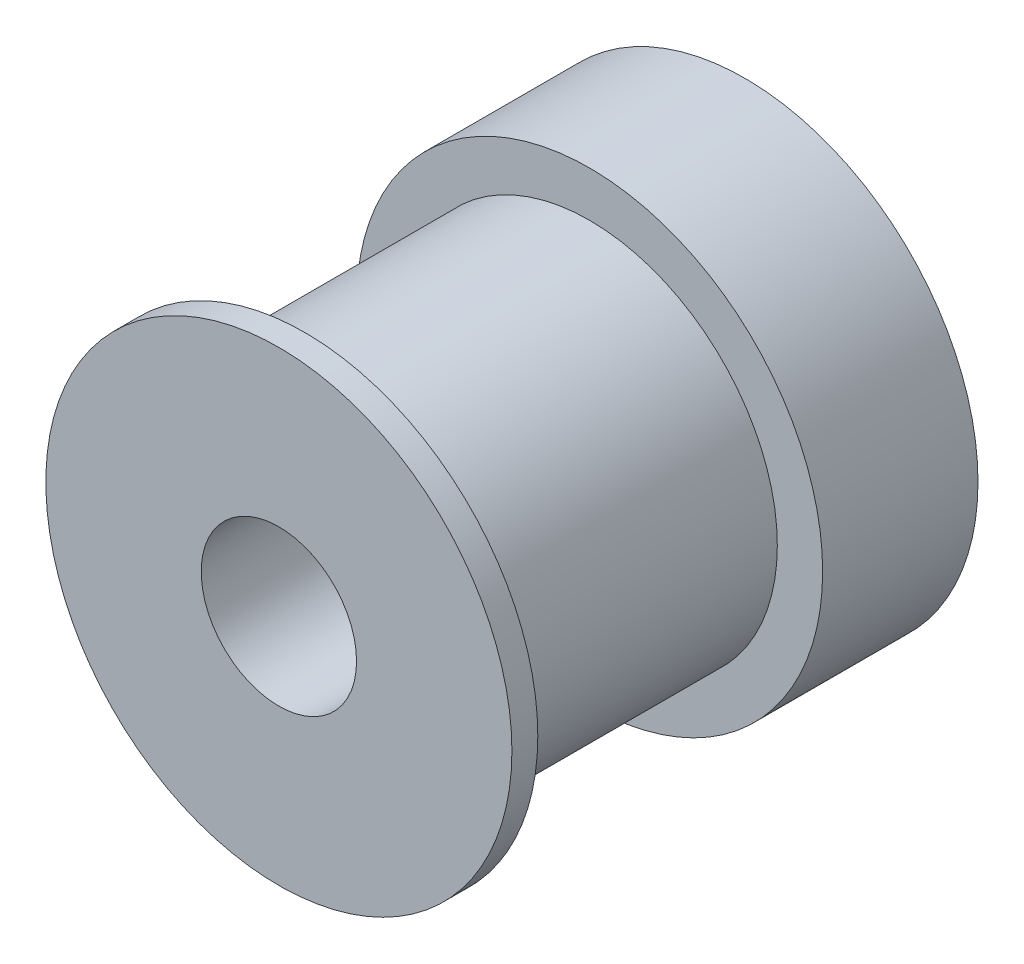
ISO-10303-21;
HEADER;
FILE_DESCRIPTION(('STEP AP214'),'2;1');
FILE_NAME('part.step','',(''),(''),'','','');
FILE_SCHEMA(('AUTOMOTIVE_DESIGN { 1 0 10303 214 1 1 1 1 }'));
ENDSEC;
DATA;
#1=APPLICATION_CONTEXT('core data for automotive mechanical design processes');
#2=APPLICATION_PROTOCOL_DEFINITION('international standard','automotive_design',2000,#1);
#3=PRODUCT_CONTEXT('',#1,'mechanical');
#4=PRODUCT('Part','Part','',(#3));
#5=PRODUCT_RELATED_PRODUCT_CATEGORY('part','',(#4));
#6=PRODUCT_DEFINITION_FORMATION('','',#4);
#7=PRODUCT_DEFINITION_CONTEXT('part definition',#1,'design');
#8=PRODUCT_DEFINITION('design','',#6,#7);
#9=PRODUCT_DEFINITION_SHAPE('','',#8);
#10=(LENGTH_UNIT() NAMED_UNIT(*) SI_UNIT(.MILLI.,.METRE.));
#11=(NAMED_UNIT(*) PLANE_ANGLE_UNIT() SI_UNIT($,.RADIAN.));
#12=(NAMED_UNIT(*) SI_UNIT($,.STERADIAN.) SOLID_ANGLE_UNIT());
#13=UNCERTAINTY_MEASURE_WITH_UNIT(LENGTH_MEASURE(1.E-05),#10,'distance_accuracy_value','');
#14=(GEOMETRIC_REPRESENTATION_CONTEXT(3) GLOBAL_UNCERTAINTY_ASSIGNED_CONTEXT((#13)) GLOBAL_UNIT_ASSIGNED_CONTEXT((#10,
#11,#12)) REPRESENTATION_CONTEXT('',''));
#15=CARTESIAN_POINT('',(0.,0.,0.));
#16=DIRECTION('',(0.,0.,1.));
#17=DIRECTION('',(1.,0.,0.));
#18=AXIS2_PLACEMENT_3D('',#15,#16,#17);
#19=CARTESIAN_POINT('',(0.,0.,6.));
#20=DIRECTION('',(0.,0.,1.));
#21=DIRECTION('',(1.,0.,0.));
#22=AXIS2_PLACEMENT_3D('',#19,#20,#21);
#23=PLANE('',#22);
#24=CARTESIAN_POINT('',(0.,0.,6.));
#25=DIRECTION('',(0.,0.,1.));
#26=DIRECTION('',(1.,0.,0.));
#27=AXIS2_PLACEMENT_3D('',#24,#25,#26);
#28=CIRCLE('',#27,7.25);
#29=CARTESIAN_POINT('',(7.25,0.,6.));
#30=VERTEX_POINT('',#29);
#31=EDGE_CURVE('E10',#30,#30,#28,.T.);
#32=ORIENTED_EDGE('',*,*,#31,.F.);
#33=EDGE_LOOP('',(#32));
#34=FACE_BOUND('',#33,.T.);
#35=CARTESIAN_POINT('',(0.,0.,6.));
#36=DIRECTION('',(0.,0.,1.));
#37=DIRECTION('',(1.,0.,0.));
#38=AXIS2_PLACEMENT_3D('',#35,#36,#37);
#39=CIRCLE('',#38,9.);
#40=CARTESIAN_POINT('',(9.,0.,6.));
#41=VERTEX_POINT('',#40);
#42=EDGE_CURVE('E46',#41,#41,#39,.T.);
#43=ORIENTED_EDGE('',*,*,#42,.T.);
#44=EDGE_LOOP('',(#43));
#45=FACE_BOUND('',#44,.T.);
#46=ADVANCED_FACE('F32',(#34,#45),#23,.T.);
#47=CARTESIAN_POINT('',(0.,0.,0.));
#48=DIRECTION('',(0.,0.,1.));
#49=DIRECTION('',(1.,0.,0.));
#50=AXIS2_PLACEMENT_3D('',#47,#48,#49);
#51=PLANE('',#50);
#52=CARTESIAN_POINT('',(0.,0.,0.));
#53=DIRECTION('',(0.,0.,1.));
#54=DIRECTION('',(1.,0.,0.));
#55=AXIS2_PLACEMENT_3D('',#52,#53,#54);
#56=CIRCLE('',#55,9.);
#57=CARTESIAN_POINT('',(9.,0.,0.));
#58=VERTEX_POINT('',#57);
#59=EDGE_CURVE('E51',#58,#58,#56,.T.);
#60=ORIENTED_EDGE('',*,*,#59,.F.);
#61=EDGE_LOOP('',(#60));
#62=FACE_BOUND('',#61,.T.);
#63=CARTESIAN_POINT('',(0.,0.,0.));
#64=DIRECTION('',(0.,0.,1.));
#65=DIRECTION('',(1.,0.,0.));
#66=AXIS2_PLACEMENT_3D('',#63,#64,#65);
#67=CIRCLE('',#66,3.);
#68=CARTESIAN_POINT('',(3.,0.,0.));
#69=VERTEX_POINT('',#68);
#70=EDGE_CURVE('E57',#69,#69,#67,.T.);
#71=ORIENTED_EDGE('',*,*,#70,.T.);
#72=EDGE_LOOP('',(#71));
#73=FACE_BOUND('',#72,.T.);
#74=ADVANCED_FACE('F63',(#62,#73),#51,.F.);
#75=CARTESIAN_POINT('',(0.,0.,6.));
#76=DIRECTION('',(0.,0.,-1.));
#77=DIRECTION('',(-1.,0.,0.));
#78=AXIS2_PLACEMENT_3D('',#75,#76,#77);
#79=CYLINDRICAL_SURFACE('',#78,9.);
#80=CARTESIAN_POINT('',(0.,-9.,5.5));
#81=CARTESIAN_POINT('',(0.0836345429749289,-8.99999856701294,5.49999664663131));
#82=CARTESIAN_POINT('',(0.167314729103293,-8.9988220674782,5.49298163501865));
#83=CARTESIAN_POINT('',(0.332328133003826,-8.99424206964832,5.46511860474081));
#84=CARTESIAN_POINT('',(0.413659120775548,-8.99083652354334,5.44425786585304));
#85=CARTESIAN_POINT('',(0.571562848327586,-8.9821804094187,5.38935073084435));
#86=CARTESIAN_POINT('',(0.64813942105914,-8.97693135095516,5.35531512061566));
#87=CARTESIAN_POINT('',(0.794485105186767,-8.96516536249242,5.27505262476856));
#88=CARTESIAN_POINT('',(0.864254993927155,-8.9586485775266,5.2288271335102));
#89=CARTESIAN_POINT('',(0.995683568575009,-8.94499990474988,5.12502694970772));
#90=CARTESIAN_POINT('',(1.05726774212098,-8.93786323088914,5.06735853121832));
#91=CARTESIAN_POINT('',(1.16993309919596,-8.92381576126039,4.94251121891631));
#92=CARTESIAN_POINT('',(1.22101361963458,-8.916904979776,4.87533172512603));
#93=CARTESIAN_POINT('',(1.31152027536308,-8.90404539455868,4.73285742028177));
#94=CARTESIAN_POINT('',(1.3508727317166,-8.89810277454982,4.65751519791714));
#95=CARTESIAN_POINT('',(1.41633501924673,-8.88791873876805,4.50117426141962));
#96=CARTESIAN_POINT('',(1.44244574493937,-8.88367720808584,4.42017592979342));
#97=CARTESIAN_POINT('',(1.48044862667088,-8.87742322105653,4.25561183508608));
#98=CARTESIAN_POINT('',(1.49246941748124,-8.8753906109142,4.17207655809916));
#99=CARTESIAN_POINT('',(1.50235003517393,-8.87372363361989,4.00415183386992));
#100=CARTESIAN_POINT('',(1.5002108642334,-8.87408909674328,3.91976244749962));
#101=CARTESIAN_POINT('',(1.48193705903769,-8.87715857318133,3.75344328323473));
#102=CARTESIAN_POINT('',(1.46594692913386,-8.8798384399135,3.67149711787286));
#103=CARTESIAN_POINT('',(1.42065188424207,-8.88719697126605,3.51146720930252));
#104=CARTESIAN_POINT('',(1.39134651259184,-8.89187570443963,3.43338359866687));
#105=CARTESIAN_POINT('',(1.32010634765635,-8.9027308760046,3.28286270593545));
#106=CARTESIAN_POINT('',(1.27811154832783,-8.90891440264395,3.21045435635126));
#107=CARTESIAN_POINT('',(1.18272721053446,-8.92207751049005,3.07365735967697));
#108=CARTESIAN_POINT('',(1.12933675239257,-8.92905715592572,3.00926936052704));
#109=CARTESIAN_POINT('',(1.01188932729543,-8.94313216727871,2.88950434851559));
#110=CARTESIAN_POINT('',(0.947708378323875,-8.95022789538991,2.83424888887595));
#111=CARTESIAN_POINT('',(0.810921149388987,-8.96365560838034,2.7352733424008));
#112=CARTESIAN_POINT('',(0.738314815143852,-8.96998758833847,2.69155332989006));
#113=CARTESIAN_POINT('',(0.586623549700026,-8.98118335735747,2.61687866371823));
#114=CARTESIAN_POINT('',(0.507533235338796,-8.98604591044468,2.58593474840125));
#115=CARTESIAN_POINT('',(0.345179007361638,-8.99374501807596,2.53780347085241));
#116=CARTESIAN_POINT('',(0.26191544350768,-8.99658174210284,2.52061495781577));
#117=CARTESIAN_POINT('',(0.0946259407809733,-8.99988677905612,2.50064718492332));
#118=CARTESIAN_POINT('',(0.010620442290606,-9.00038251807671,2.49770105691664));
#119=CARTESIAN_POINT('',(-0.156683863733933,-8.99902484652702,2.50585680665687));
#120=CARTESIAN_POINT('',(-0.239982698335224,-8.99717152634471,2.51695814388024));
#121=CARTESIAN_POINT('',(-0.402993705328059,-8.99134096162921,2.55275490960129));
#122=CARTESIAN_POINT('',(-0.482724521031229,-8.98737662880787,2.57736772503408));
#123=CARTESIAN_POINT('',(-0.636928130916266,-8.97776678673215,2.63940071091972));
#124=CARTESIAN_POINT('',(-0.711400629545832,-8.97212118307212,2.67682160058116));
#125=CARTESIAN_POINT('',(-0.853698413681376,-8.95970709781444,2.76379067481807));
#126=CARTESIAN_POINT('',(-0.92145915056229,-8.95292913532213,2.81344309370035));
#127=CARTESIAN_POINT('',(-1.04774615130161,-8.93903080435141,2.92332238923104));
#128=CARTESIAN_POINT('',(-1.10627174381795,-8.93191041102928,2.983550033966));
#129=CARTESIAN_POINT('',(-1.2130456677948,-8.91804105141507,3.11361852884285));
#130=CARTESIAN_POINT('',(-1.26118125666823,-8.91129669682264,3.18355249930865));
#131=CARTESIAN_POINT('',(-1.34502138617699,-8.8990291786673,3.33061178148312));
#132=CARTESIAN_POINT('',(-1.38072632086189,-8.89350597639612,3.4077368651365));
#133=CARTESIAN_POINT('',(-1.43852299888389,-8.88434072218623,3.56667383968728));
#134=CARTESIAN_POINT('',(-1.46067085952877,-8.88069092586639,3.64846485701829));
#135=CARTESIAN_POINT('',(-1.49090127226697,-8.87566630101156,3.81467207753306));
#136=CARTESIAN_POINT('',(-1.4989850471677,-8.87429127469633,3.89908805183923));
#137=CARTESIAN_POINT('',(-1.50082371962841,-8.87398039850407,4.06702309957745));
#138=CARTESIAN_POINT('',(-1.49475608167511,-8.8750143390339,4.15054022714517));
#139=CARTESIAN_POINT('',(-1.46884790337411,-8.87933868872237,4.31534754883046));
#140=CARTESIAN_POINT('',(-1.44900740766749,-8.88262909056728,4.39663775016512));
#141=CARTESIAN_POINT('',(-1.39618469375694,-8.89108413769031,4.55461506237557));
#142=CARTESIAN_POINT('',(-1.36321775436026,-8.89624660331802,4.63130740603362));
#143=CARTESIAN_POINT('',(-1.28509620234954,-8.90786621353324,4.77810140151691));
#144=CARTESIAN_POINT('',(-1.23994098524914,-8.91432342233039,4.84820272622328));
#145=CARTESIAN_POINT('',(-1.13809133062329,-8.92790072427373,4.98072134986465));
#146=CARTESIAN_POINT('',(-1.08126633815619,-8.93502777345781,5.04303761002017));
#147=CARTESIAN_POINT('',(-0.957965418828137,-8.94908623416505,5.15731096268496));
#148=CARTESIAN_POINT('',(-0.891487267747581,-8.95601760015928,5.2092656611829));
#149=CARTESIAN_POINT('',(-0.750221501784168,-8.96895917785332,5.30166896091997));
#150=CARTESIAN_POINT('',(-0.67537967251969,-8.97496269751862,5.34203562358777));
#151=CARTESIAN_POINT('',(-0.519907841627388,-8.98530700561065,5.40956169076595));
#152=CARTESIAN_POINT('',(-0.439283696898005,-8.98964944906489,5.43673424864782));
#153=CARTESIAN_POINT('',(-0.29862198602724,-8.99523474499773,5.471203164476));
#154=CARTESIAN_POINT('',(-0.239435298179068,-8.99701216364015,5.48198468176958));
#155=CARTESIAN_POINT('',(-0.120173586191886,-8.99939529591672,5.49638424270685));
#156=CARTESIAN_POINT('',(-0.0600985773650966,-9.00000102972385,5.50000240968242));
#157=CARTESIAN_POINT('',(0.,-9.,5.5));
#158=B_SPLINE_CURVE_WITH_KNOTS('',3,(#80,#81,#82,#83,#84,#85,#86,#87,#88,#89,#90,#91,#92,#93,
#94,#95,#96,#97,#98,#99,#100,#101,#102,#103,#104,#105,#106,#107,#108,#109,#110,#111,#112,#113,
#114,#115,#116,#117,#118,#119,#120,#121,#122,#123,#124,#125,#126,#127,#128,#129,#130,#131,#132,
#133,#134,#135,#136,#137,#138,#139,#140,#141,#142,#143,#144,#145,#146,#147,#148,#149,#150,#151,
#152,#153,#154,#155,#156,#157),.UNSPECIFIED.,.T.,.F.,(4,2,2,2,2,2,2,2,2,2,2,2,2,2,2,2,2,2,2,2,2,
2,2,2,2,2,2,2,2,2,2,2,2,2,2,2,2,2,4),(0.,0.250683950963106,0.501598527417252,0.752308120215162,
1.00298904760487,1.25581494637399,1.50865680101914,1.76305512494304,2.01743626125709,
2.26947646262054,2.52149882592532,2.77092313056245,3.02035599015229,3.27098733979534,
3.52163892408344,3.77539661946796,4.02915594981509,4.28312813349542,4.53707906712689,
4.78804730094838,5.03900587821516,5.28844684203849,5.5379018149564,5.78956095376214,
6.0412383783257,6.29552293204571,6.54979942425566,6.80301613405063,7.05621082671971,
7.3062474571362,7.5562832771288,7.80602890935734,8.05578693017602,8.30850830516035,
8.56128800327383,8.8158133896432,9.07008451278043,9.25022548898411,9.43036336366181),.UNSPECIFIED.);
#159=CARTESIAN_POINT('',(0.,-9.,5.5));
#160=VERTEX_POINT('',#159);
#161=EDGE_CURVE('E78',#160,#160,#158,.T.);
#162=ORIENTED_EDGE('',*,*,#161,.T.);
#163=EDGE_LOOP('',(#162));
#164=FACE_BOUND('',#163,.T.);
#165=ORIENTED_EDGE('',*,*,#42,.F.);
#166=EDGE_LOOP('',(#165));
#167=FACE_BOUND('',#166,.T.);
#168=ORIENTED_EDGE('',*,*,#59,.T.);
#169=EDGE_LOOP('',(#168));
#170=FACE_BOUND('',#169,.T.);
#171=ADVANCED_FACE('F34',(#164,#167,#170),#79,.T.);
#172=CARTESIAN_POINT('',(0.,0.,6.));
#173=DIRECTION('',(0.,0.,-1.));
#174=DIRECTION('',(-1.,0.,0.));
#175=AXIS2_PLACEMENT_3D('',#172,#173,#174);
#176=CYLINDRICAL_SURFACE('',#175,3.);
#177=CARTESIAN_POINT('',(0.,-3.,5.5));
#178=CARTESIAN_POINT('',(0.0788579444268502,-2.99999570107562,5.49999504652421));
#179=CARTESIAN_POINT('',(0.157809899546344,-2.99685736529635,5.49374489031842));
#180=CARTESIAN_POINT('',(0.313380352903344,-2.98461234055736,5.46902067948769));
#181=CARTESIAN_POINT('',(0.389994130070444,-2.97549431743379,5.45052341050328));
#182=CARTESIAN_POINT('',(0.538400317320673,-2.95224419105063,5.40220928707506));
#183=CARTESIAN_POINT('',(0.61021020440872,-2.93813158766306,5.37243642362805));
#184=CARTESIAN_POINT('',(0.747708925209898,-2.90618664773642,5.30264406795252));
#185=CARTESIAN_POINT('',(0.813398240985089,-2.88835460450288,5.2626253836267));
#186=CARTESIAN_POINT('',(0.941261726642864,-2.84934387387093,5.17072412577207));
#187=CARTESIAN_POINT('',(1.00298281668316,-2.82802798691306,5.11827028114054));
#188=CARTESIAN_POINT('',(1.11716916730047,-2.78489955370115,5.00421778112945));
#189=CARTESIAN_POINT('',(1.16962737466015,-2.76308664313552,4.94261222234134));
#190=CARTESIAN_POINT('',(1.26787800067542,-2.71948426796021,4.80627497571493));
#191=CARTESIAN_POINT('',(1.31283800332745,-2.69782780455198,4.73089585248113));
#192=CARTESIAN_POINT('',(1.38925234033604,-2.65928968158481,4.57244899602068));
#193=CARTESIAN_POINT('',(1.4207163224495,-2.64240461410484,4.48938680691588));
#194=CARTESIAN_POINT('',(1.46719866328288,-2.61686800556713,4.32300234186712));
#195=CARTESIAN_POINT('',(1.48308878562066,-2.6077840737557,4.23999332189891));
#196=CARTESIAN_POINT('',(1.50064048996327,-2.59772834922792,4.07203174333079));
#197=CARTESIAN_POINT('',(1.50231613255961,-2.59674854014932,3.98708118869327));
#198=CARTESIAN_POINT('',(1.49203093075844,-2.60266395385873,3.82857096352695));
#199=CARTESIAN_POINT('',(1.48167683930523,-2.6086314549302,3.75486395316542));
#200=CARTESIAN_POINT('',(1.4504097735854,-2.62614343100775,3.61041713594044));
#201=CARTESIAN_POINT('',(1.42949343584648,-2.63768968247664,3.53967828204203));
#202=CARTESIAN_POINT('',(1.37731467057901,-2.66531214619112,3.40115630115151));
#203=CARTESIAN_POINT('',(1.34582260067399,-2.68148760995998,3.33348040182132));
#204=CARTESIAN_POINT('',(1.273562531502,-2.71655106422106,3.20404856111499));
#205=CARTESIAN_POINT('',(1.2327903657187,-2.73544027170286,3.14229529659987));
#206=CARTESIAN_POINT('',(1.13709908236918,-2.77669736854929,3.01821812088516));
#207=CARTESIAN_POINT('',(1.08104168755392,-2.79920265355119,2.95681468963576));
#208=CARTESIAN_POINT('',(0.95933336811206,-2.84321434950611,2.84389687211365));
#209=CARTESIAN_POINT('',(0.893677884861428,-2.86472027938201,2.79238721194918));
#210=CARTESIAN_POINT('',(0.750774758747772,-2.90552980924446,2.69847150845541));
#211=CARTESIAN_POINT('',(0.673130387399113,-2.92468476243011,2.65659929133139));
#212=CARTESIAN_POINT('',(0.510699323233195,-2.95736821681863,2.58685445643549));
#213=CARTESIAN_POINT('',(0.425918364397913,-2.9709011841533,2.55897072247725));
#214=CARTESIAN_POINT('',(0.259149737491053,-2.98986500612153,2.52028689442499));
#215=CARTESIAN_POINT('',(0.177512295822489,-2.99587407451965,2.50826314637983));
#216=CARTESIAN_POINT('',(0.0131693999240275,-3.00109520188655,2.49780290329827));
#217=CARTESIAN_POINT('',(-0.069535529804863,-3.00031048081978,2.4993599715408));
#218=CARTESIAN_POINT('',(-0.22684945797898,-2.99236788380152,2.51531003262812));
#219=CARTESIAN_POINT('',(-0.301589112074895,-2.98570868532253,2.52869879909499));
#220=CARTESIAN_POINT('',(-0.447610338452911,-2.9673325697226,2.56635710784268));
#221=CARTESIAN_POINT('',(-0.51889152853663,-2.95561509501618,2.59062784968024));
#222=CARTESIAN_POINT('',(-0.658332912674359,-2.92776377120382,2.64999769964955));
#223=CARTESIAN_POINT('',(-0.726345595508704,-2.91151322654446,2.68538657517443));
#224=CARTESIAN_POINT('',(-0.855692042548907,-2.87615961476126,2.76566130346985));
#225=CARTESIAN_POINT('',(-0.917022944664887,-2.85705533350407,2.81055120189309));
#226=CARTESIAN_POINT('',(-1.03765153393382,-2.81562332004297,2.91364063799607));
#227=CARTESIAN_POINT('',(-1.09615811672854,-2.79316327265249,2.97271430266772));
#228=CARTESIAN_POINT('',(-1.20278448167828,-2.7489358741323,3.09988772691659));
#229=CARTESIAN_POINT('',(-1.25089707856781,-2.72716901100071,3.16799367827188));
#230=CARTESIAN_POINT('',(-1.33756187171853,-2.68576788309734,3.31546548125946));
#231=CARTESIAN_POINT('',(-1.37553824370037,-2.66628794383591,3.39521689914172));
#232=CARTESIAN_POINT('',(-1.43712423890206,-2.63361108441202,3.56126510136245));
#233=CARTESIAN_POINT('',(-1.46075237380052,-2.62040607332625,3.64755328970034));
#234=CARTESIAN_POINT('',(-1.49079253120031,-2.60342251538703,3.81536533432706));
#235=CARTESIAN_POINT('',(-1.49863949460818,-2.59886075197597,3.89655138015286));
#236=CARTESIAN_POINT('',(-1.5010337315643,-2.59748031962405,4.05917060074679));
#237=CARTESIAN_POINT('',(-1.49558676993486,-2.60065829439585,4.14060365310679));
#238=CARTESIAN_POINT('',(-1.47288918838996,-2.61356793076615,4.29322525230016));
#239=CARTESIAN_POINT('',(-1.45681247151455,-2.62264641723988,4.36465070521711));
#240=CARTESIAN_POINT('',(-1.41476303733662,-2.64556524281479,4.50371217913655));
#241=CARTESIAN_POINT('',(-1.38878713673988,-2.65940711354503,4.57134697313805));
#242=CARTESIAN_POINT('',(-1.32572361795085,-2.69142795546804,4.70593727647981));
#243=CARTESIAN_POINT('',(-1.28800670672355,-2.70983583593881,4.77254185274354));
#244=CARTESIAN_POINT('',(-1.20322645745609,-2.74852997452291,4.89891180427189));
#245=CARTESIAN_POINT('',(-1.15615825686234,-2.76881720693416,4.95867359578167));
#246=CARTESIAN_POINT('',(-1.04730498999206,-2.81193484737138,5.07721297353201));
#247=CARTESIAN_POINT('',(-0.984426634495892,-2.83477474959942,5.13498865352544));
#248=CARTESIAN_POINT('',(-0.849232209349796,-2.87816628389896,5.2393944751529));
#249=CARTESIAN_POINT('',(-0.776911084957796,-2.89871667939293,5.28601860920486));
#250=CARTESIAN_POINT('',(-0.623897395174418,-2.93547014349806,5.3668545440681));
#251=CARTESIAN_POINT('',(-0.543149255665096,-2.95164144740899,5.4009762538547));
#252=CARTESIAN_POINT('',(-0.37611315170713,-2.9775201194848,5.45471225163611));
#253=CARTESIAN_POINT('',(-0.28984169938365,-2.98724585044602,5.47436777020857));
#254=CARTESIAN_POINT('',(-0.168902919736342,-2.99543192870217,5.49084611662861));
#255=CARTESIAN_POINT('',(-0.135242819162346,-2.99714048010376,5.49427396129951));
#256=CARTESIAN_POINT('',(-0.0677275977076366,-2.99942545465223,5.49885199827113));
#257=CARTESIAN_POINT('',(-0.0338724714699423,-3.00000184655071,5.50000212770531));
#258=CARTESIAN_POINT('',(0.,-3.,5.5));
#259=B_SPLINE_CURVE_WITH_KNOTS('',3,(#177,#178,#179,#180,#181,#182,#183,#184,#185,#186,#187,
#188,#189,#190,#191,#192,#193,#194,#195,#196,#197,#198,#199,#200,#201,#202,#203,#204,#205,#206,
#207,#208,#209,#210,#211,#212,#213,#214,#215,#216,#217,#218,#219,#220,#221,#222,#223,#224,#225,
#226,#227,#228,#229,#230,#231,#232,#233,#234,#235,#236,#237,#238,#239,#240,#241,#242,#243,#244,
#245,#246,#247,#248,#249,#250,#251,#252,#253,#254,#255,#256,#257,#258),.UNSPECIFIED.,.T.,.F.,(4,
2,2,2,2,2,2,2,2,2,2,2,2,2,2,2,2,2,2,2,2,2,2,2,2,2,2,2,2,2,2,2,2,2,2,2,2,2,2,2,4),(0.,
0.236436386130439,0.473322224563796,0.709293233238448,0.945245640872351,1.19547263807713,
1.44588935648105,1.71572589646129,1.98536921847421,2.23887018210344,2.49212035993531,
2.71508568613981,2.93812205888518,3.16635360252731,3.39468781890333,3.65197412000818,
3.9093830189803,4.17874533321661,4.44789325368419,4.69474935707018,4.94148846767214,
5.16910359759183,5.39674382446397,5.63089284041848,5.86514176122509,6.12239415966628,
6.37982382923148,6.64972023242589,6.91926767918176,7.1629396125457,7.40650589797017,
7.62686895373284,7.84730293182527,8.08254685170431,8.31791341715446,8.58187864135757,
8.84598575071869,9.1119602049529,9.37717362931724,9.47872920200875,9.58028757766599),.UNSPECIFIED.);
#260=CARTESIAN_POINT('',(0.,-3.,5.5));
#261=VERTEX_POINT('',#260);
#262=EDGE_CURVE('E37',#261,#261,#259,.T.);
#263=ORIENTED_EDGE('',*,*,#262,.F.);
#264=EDGE_LOOP('',(#263));
#265=FACE_BOUND('',#264,.T.);
#266=ORIENTED_EDGE('',*,*,#70,.F.);
#267=EDGE_LOOP('',(#266));
#268=FACE_BOUND('',#267,.T.);
#269=CARTESIAN_POINT('',(0.,0.,18.));
#270=DIRECTION('',(0.,0.,1.));
#271=DIRECTION('',(1.,0.,0.));
#272=AXIS2_PLACEMENT_3D('',#269,#270,#271);
#273=CIRCLE('',#272,3.);
#274=CARTESIAN_POINT('',(3.,0.,18.));
#275=VERTEX_POINT('',#274);
#276=EDGE_CURVE('E75',#275,#275,#273,.T.);
#277=ORIENTED_EDGE('',*,*,#276,.T.);
#278=EDGE_LOOP('',(#277));
#279=FACE_BOUND('',#278,.T.);
#280=ADVANCED_FACE('F68',(#265,#268,#279),#176,.F.);
#281=CARTESIAN_POINT('',(0.,0.,17.));
#282=DIRECTION('',(0.,0.,-1.));
#283=DIRECTION('',(-1.,0.,0.));
#284=AXIS2_PLACEMENT_3D('',#281,#282,#283);
#285=CYLINDRICAL_SURFACE('',#284,7.25);
#286=CARTESIAN_POINT('',(0.,0.,17.));
#287=DIRECTION('',(0.,0.,1.));
#288=DIRECTION('',(1.,0.,0.));
#289=AXIS2_PLACEMENT_3D('',#286,#287,#288);
#290=CIRCLE('',#289,7.25);
#291=CARTESIAN_POINT('',(7.25,0.,17.));
#292=VERTEX_POINT('',#291);
#293=EDGE_CURVE('E55',#292,#292,#290,.T.);
#294=ORIENTED_EDGE('',*,*,#293,.F.);
#295=EDGE_LOOP('',(#294));
#296=FACE_BOUND('',#295,.T.);
#297=ORIENTED_EDGE('',*,*,#31,.T.);
#298=EDGE_LOOP('',(#297));
#299=FACE_BOUND('',#298,.T.);
#300=ADVANCED_FACE('F71',(#296,#299),#285,.T.);
#301=CARTESIAN_POINT('',(0.,0.,18.));
#302=DIRECTION('',(0.,0.,1.));
#303=DIRECTION('',(1.,0.,0.));
#304=AXIS2_PLACEMENT_3D('',#301,#302,#303);
#305=PLANE('',#304);
#306=CARTESIAN_POINT('',(0.,0.,18.));
#307=DIRECTION('',(0.,0.,1.));
#308=DIRECTION('',(1.,0.,0.));
#309=AXIS2_PLACEMENT_3D('',#306,#307,#308);
#310=CIRCLE('',#309,9.);
#311=CARTESIAN_POINT('',(9.,0.,18.));
#312=VERTEX_POINT('',#311);
#313=EDGE_CURVE('E81',#312,#312,#310,.T.);
#314=ORIENTED_EDGE('',*,*,#313,.T.);
#315=EDGE_LOOP('',(#314));
#316=FACE_BOUND('',#315,.T.);
#317=ORIENTED_EDGE('',*,*,#276,.F.);
#318=EDGE_LOOP('',(#317));
#319=FACE_BOUND('',#318,.T.);
#320=ADVANCED_FACE('F98',(#316,#319),#305,.T.);
#321=CARTESIAN_POINT('',(0.,0.,17.));
#322=DIRECTION('',(0.,0.,1.));
#323=DIRECTION('',(1.,0.,0.));
#324=AXIS2_PLACEMENT_3D('',#321,#322,#323);
#325=PLANE('',#324);
#326=ORIENTED_EDGE('',*,*,#293,.T.);
#327=EDGE_LOOP('',(#326));
#328=FACE_BOUND('',#327,.T.);
#329=CARTESIAN_POINT('',(0.,0.,17.));
#330=DIRECTION('',(0.,0.,1.));
#331=DIRECTION('',(1.,0.,0.));
#332=AXIS2_PLACEMENT_3D('',#329,#330,#331);
#333=CIRCLE('',#332,9.);
#334=CARTESIAN_POINT('',(9.,0.,17.));
#335=VERTEX_POINT('',#334);
#336=EDGE_CURVE('E77',#335,#335,#333,.T.);
#337=ORIENTED_EDGE('',*,*,#336,.F.);
#338=EDGE_LOOP('',(#337));
#339=FACE_BOUND('',#338,.T.);
#340=ADVANCED_FACE('F94',(#328,#339),#325,.F.);
#341=CARTESIAN_POINT('',(0.,0.,18.));
#342=DIRECTION('',(0.,0.,-1.));
#343=DIRECTION('',(-1.,0.,0.));
#344=AXIS2_PLACEMENT_3D('',#341,#342,#343);
#345=CYLINDRICAL_SURFACE('',#344,9.);
#346=ORIENTED_EDGE('',*,*,#313,.F.);
#347=EDGE_LOOP('',(#346));
#348=FACE_BOUND('',#347,.T.);
#349=ORIENTED_EDGE('',*,*,#336,.T.);
#350=EDGE_LOOP('',(#349));
#351=FACE_BOUND('',#350,.T.);
#352=ADVANCED_FACE('F122',(#348,#351),#345,.T.);
#353=CARTESIAN_POINT('',(0.,-9.,4.));
#354=DIRECTION('',(0.,1.,0.));
#355=DIRECTION('',(0.,0.,1.));
#356=AXIS2_PLACEMENT_3D('',#353,#354,#355);
#357=CYLINDRICAL_SURFACE('',#356,1.5);
#358=ORIENTED_EDGE('',*,*,#262,.T.);
#359=EDGE_LOOP('',(#358));
#360=FACE_BOUND('',#359,.T.);
#361=ORIENTED_EDGE('',*,*,#161,.F.);
#362=EDGE_LOOP('',(#361));
#363=FACE_BOUND('',#362,.T.);
#364=ADVANCED_FACE('F120',(#360,#363),#357,.F.);
#365=CLOSED_SHELL('',(#46,#74,#171,#280,#300,#320,#340,#352,#364));
#366=MANIFOLD_SOLID_BREP('B2',#365);
#367=ADVANCED_BREP_SHAPE_REPRESENTATION('',(#18,#366),#14);
#368=SHAPE_DEFINITION_REPRESENTATION(#9,#367);
ENDSEC;
END-ISO-10303-21;
